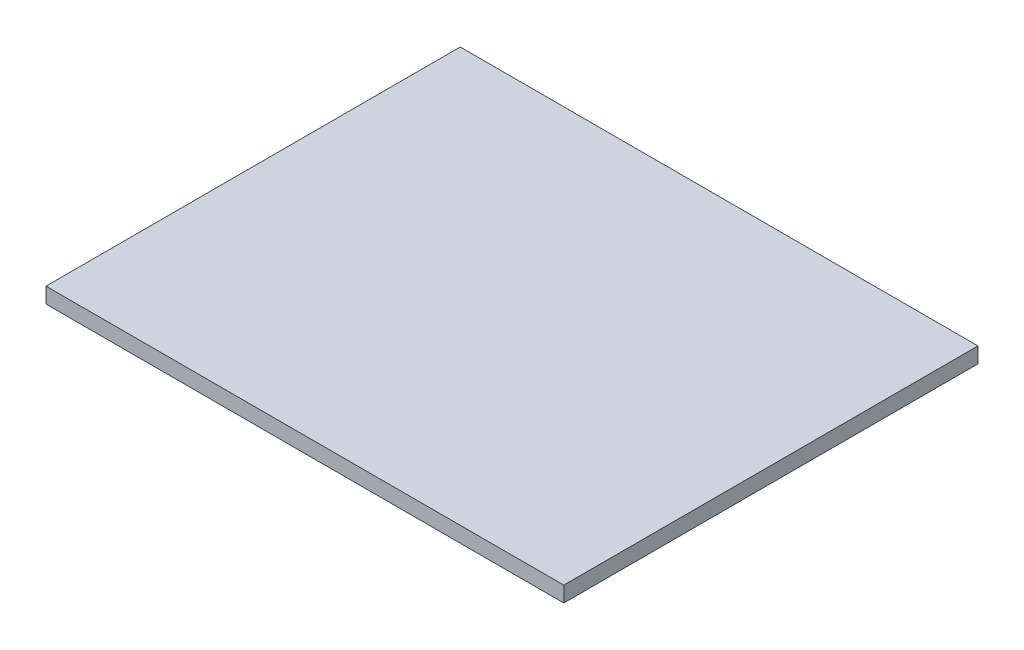
ISO-10303-21;
HEADER;
FILE_DESCRIPTION(('STEP AP214'),'2;1');
FILE_NAME('part.step','',(''),(''),'','','');
FILE_SCHEMA(('AUTOMOTIVE_DESIGN { 1 0 10303 214 1 1 1 1 }'));
ENDSEC;
DATA;
#1=APPLICATION_CONTEXT('core data for automotive mechanical design processes');
#2=APPLICATION_PROTOCOL_DEFINITION('international standard','automotive_design',2000,#1);
#3=PRODUCT_CONTEXT('',#1,'mechanical');
#4=PRODUCT('Part','Part','',(#3));
#5=PRODUCT_RELATED_PRODUCT_CATEGORY('part','',(#4));
#6=PRODUCT_DEFINITION_FORMATION('','',#4);
#7=PRODUCT_DEFINITION_CONTEXT('part definition',#1,'design');
#8=PRODUCT_DEFINITION('design','',#6,#7);
#9=PRODUCT_DEFINITION_SHAPE('','',#8);
#10=(LENGTH_UNIT() NAMED_UNIT(*) SI_UNIT(.MILLI.,.METRE.));
#11=(NAMED_UNIT(*) PLANE_ANGLE_UNIT() SI_UNIT($,.RADIAN.));
#12=(NAMED_UNIT(*) SI_UNIT($,.STERADIAN.) SOLID_ANGLE_UNIT());
#13=UNCERTAINTY_MEASURE_WITH_UNIT(LENGTH_MEASURE(1.E-05),#10,'distance_accuracy_value','');
#14=(GEOMETRIC_REPRESENTATION_CONTEXT(3) GLOBAL_UNCERTAINTY_ASSIGNED_CONTEXT((#13)) GLOBAL_UNIT_ASSIGNED_CONTEXT((#10,
#11,#12)) REPRESENTATION_CONTEXT('',''));
#15=CARTESIAN_POINT('',(0.,0.,0.));
#16=DIRECTION('',(0.,0.,1.));
#17=DIRECTION('',(1.,0.,0.));
#18=AXIS2_PLACEMENT_3D('',#15,#16,#17);
#19=CARTESIAN_POINT('',(0.,3.,0.));
#20=DIRECTION('',(1.,0.,0.));
#21=DIRECTION('',(0.,0.,-1.));
#22=AXIS2_PLACEMENT_3D('',#19,#20,#21);
#23=PLANE('',#22);
#24=DIRECTION('',(0.,0.,1.));
#25=VECTOR('',#24,1.);
#26=CARTESIAN_POINT('',(0.,0.,0.));
#27=LINE('',#26,#25);
#28=CARTESIAN_POINT('',(0.,0.,-80.));
#29=VERTEX_POINT('',#28);
#30=CARTESIAN_POINT('',(0.,0.,0.));
#31=VERTEX_POINT('',#30);
#32=EDGE_CURVE('E96',#29,#31,#27,.T.);
#33=ORIENTED_EDGE('',*,*,#32,.T.);
#34=DIRECTION('',(0.,-1.,0.));
#35=VECTOR('',#34,1.);
#36=CARTESIAN_POINT('',(0.,3.,0.));
#37=LINE('',#36,#35);
#38=CARTESIAN_POINT('',(0.,3.,0.));
#39=VERTEX_POINT('',#38);
#40=EDGE_CURVE('E11',#39,#31,#37,.T.);
#41=ORIENTED_EDGE('',*,*,#40,.F.);
#42=DIRECTION('',(0.,0.,1.));
#43=VECTOR('',#42,1.);
#44=CARTESIAN_POINT('',(0.,3.,0.));
#45=LINE('',#44,#43);
#46=CARTESIAN_POINT('',(0.,3.,-80.));
#47=VERTEX_POINT('',#46);
#48=EDGE_CURVE('E84',#47,#39,#45,.T.);
#49=ORIENTED_EDGE('',*,*,#48,.F.);
#50=DIRECTION('',(0.,-1.,0.));
#51=VECTOR('',#50,1.);
#52=CARTESIAN_POINT('',(0.,3.,-80.));
#53=LINE('',#52,#51);
#54=EDGE_CURVE('E92',#47,#29,#53,.T.);
#55=ORIENTED_EDGE('',*,*,#54,.T.);
#56=EDGE_LOOP('',(#33,#41,#49,#55));
#57=FACE_BOUND('',#56,.T.);
#58=ADVANCED_FACE('F33',(#57),#23,.F.);
#59=CARTESIAN_POINT('',(0.,3.,0.));
#60=DIRECTION('',(0.,0.,-1.));
#61=DIRECTION('',(-1.,0.,0.));
#62=AXIS2_PLACEMENT_3D('',#59,#60,#61);
#63=PLANE('',#62);
#64=DIRECTION('',(1.,0.,0.));
#65=VECTOR('',#64,1.);
#66=CARTESIAN_POINT('',(0.,0.,0.));
#67=LINE('',#66,#65);
#68=CARTESIAN_POINT('',(100.,0.,0.));
#69=VERTEX_POINT('',#68);
#70=EDGE_CURVE('E88',#31,#69,#67,.T.);
#71=ORIENTED_EDGE('',*,*,#70,.T.);
#72=DIRECTION('',(0.,-1.,0.));
#73=VECTOR('',#72,1.);
#74=CARTESIAN_POINT('',(100.,3.,0.));
#75=LINE('',#74,#73);
#76=CARTESIAN_POINT('',(100.,3.,0.));
#77=VERTEX_POINT('',#76);
#78=EDGE_CURVE('E41',#77,#69,#75,.T.);
#79=ORIENTED_EDGE('',*,*,#78,.F.);
#80=DIRECTION('',(1.,0.,0.));
#81=VECTOR('',#80,1.);
#82=CARTESIAN_POINT('',(0.,3.,0.));
#83=LINE('',#82,#81);
#84=EDGE_CURVE('E79',#39,#77,#83,.T.);
#85=ORIENTED_EDGE('',*,*,#84,.F.);
#86=ORIENTED_EDGE('',*,*,#40,.T.);
#87=EDGE_LOOP('',(#71,#79,#85,#86));
#88=FACE_BOUND('',#87,.T.);
#89=ADVANCED_FACE('F87',(#88),#63,.F.);
#90=CARTESIAN_POINT('',(100.,3.,0.));
#91=DIRECTION('',(-1.,0.,0.));
#92=DIRECTION('',(0.,0.,1.));
#93=AXIS2_PLACEMENT_3D('',#90,#91,#92);
#94=PLANE('',#93);
#95=DIRECTION('',(0.,0.,-1.));
#96=VECTOR('',#95,1.);
#97=CARTESIAN_POINT('',(100.,0.,0.));
#98=LINE('',#97,#96);
#99=CARTESIAN_POINT('',(100.,0.,-80.));
#100=VERTEX_POINT('',#99);
#101=EDGE_CURVE('E66',#69,#100,#98,.T.);
#102=ORIENTED_EDGE('',*,*,#101,.T.);
#103=DIRECTION('',(0.,-1.,0.));
#104=VECTOR('',#103,1.);
#105=CARTESIAN_POINT('',(100.,3.,-80.));
#106=LINE('',#105,#104);
#107=CARTESIAN_POINT('',(100.,3.,-80.));
#108=VERTEX_POINT('',#107);
#109=EDGE_CURVE('E89',#108,#100,#106,.T.);
#110=ORIENTED_EDGE('',*,*,#109,.F.);
#111=DIRECTION('',(0.,0.,-1.));
#112=VECTOR('',#111,1.);
#113=CARTESIAN_POINT('',(100.,3.,0.));
#114=LINE('',#113,#112);
#115=EDGE_CURVE('E82',#77,#108,#114,.T.);
#116=ORIENTED_EDGE('',*,*,#115,.F.);
#117=ORIENTED_EDGE('',*,*,#78,.T.);
#118=EDGE_LOOP('',(#102,#110,#116,#117));
#119=FACE_BOUND('',#118,.T.);
#120=ADVANCED_FACE('F90',(#119),#94,.F.);
#121=CARTESIAN_POINT('',(0.,3.,-80.));
#122=DIRECTION('',(0.,0.,1.));
#123=DIRECTION('',(1.,0.,0.));
#124=AXIS2_PLACEMENT_3D('',#121,#122,#123);
#125=PLANE('',#124);
#126=DIRECTION('',(-1.,0.,0.));
#127=VECTOR('',#126,1.);
#128=CARTESIAN_POINT('',(0.,0.,-80.));
#129=LINE('',#128,#127);
#130=EDGE_CURVE('E72',#100,#29,#129,.T.);
#131=ORIENTED_EDGE('',*,*,#130,.T.);
#132=ORIENTED_EDGE('',*,*,#54,.F.);
#133=DIRECTION('',(-1.,0.,0.));
#134=VECTOR('',#133,1.);
#135=CARTESIAN_POINT('',(0.,3.,-80.));
#136=LINE('',#135,#134);
#137=EDGE_CURVE('E49',#108,#47,#136,.T.);
#138=ORIENTED_EDGE('',*,*,#137,.F.);
#139=ORIENTED_EDGE('',*,*,#109,.T.);
#140=EDGE_LOOP('',(#131,#132,#138,#139));
#141=FACE_BOUND('',#140,.T.);
#142=ADVANCED_FACE('F103',(#141),#125,.F.);
#143=CARTESIAN_POINT('',(0.,3.,0.));
#144=DIRECTION('',(0.,-1.,0.));
#145=DIRECTION('',(0.,0.,-1.));
#146=AXIS2_PLACEMENT_3D('',#143,#144,#145);
#147=PLANE('',#146);
#148=ORIENTED_EDGE('',*,*,#48,.T.);
#149=ORIENTED_EDGE('',*,*,#84,.T.);
#150=ORIENTED_EDGE('',*,*,#115,.T.);
#151=ORIENTED_EDGE('',*,*,#137,.T.);
#152=EDGE_LOOP('',(#148,#149,#150,#151));
#153=FACE_BOUND('',#152,.T.);
#154=ADVANCED_FACE('F80',(#153),#147,.F.);
#155=CARTESIAN_POINT('',(0.,0.,0.));
#156=DIRECTION('',(0.,-1.,0.));
#157=DIRECTION('',(0.,0.,-1.));
#158=AXIS2_PLACEMENT_3D('',#155,#156,#157);
#159=PLANE('',#158);
#160=ORIENTED_EDGE('',*,*,#32,.F.);
#161=ORIENTED_EDGE('',*,*,#130,.F.);
#162=ORIENTED_EDGE('',*,*,#101,.F.);
#163=ORIENTED_EDGE('',*,*,#70,.F.);
#164=EDGE_LOOP('',(#160,#161,#162,#163));
#165=FACE_BOUND('',#164,.T.);
#166=ADVANCED_FACE('F106',(#165),#159,.T.);
#167=CLOSED_SHELL('',(#58,#89,#120,#142,#154,#166));
#168=MANIFOLD_SOLID_BREP('B2',#167);
#169=ADVANCED_BREP_SHAPE_REPRESENTATION('',(#18,#168),#14);
#170=SHAPE_DEFINITION_REPRESENTATION(#9,#169);
ENDSEC;
END-ISO-10303-21;
